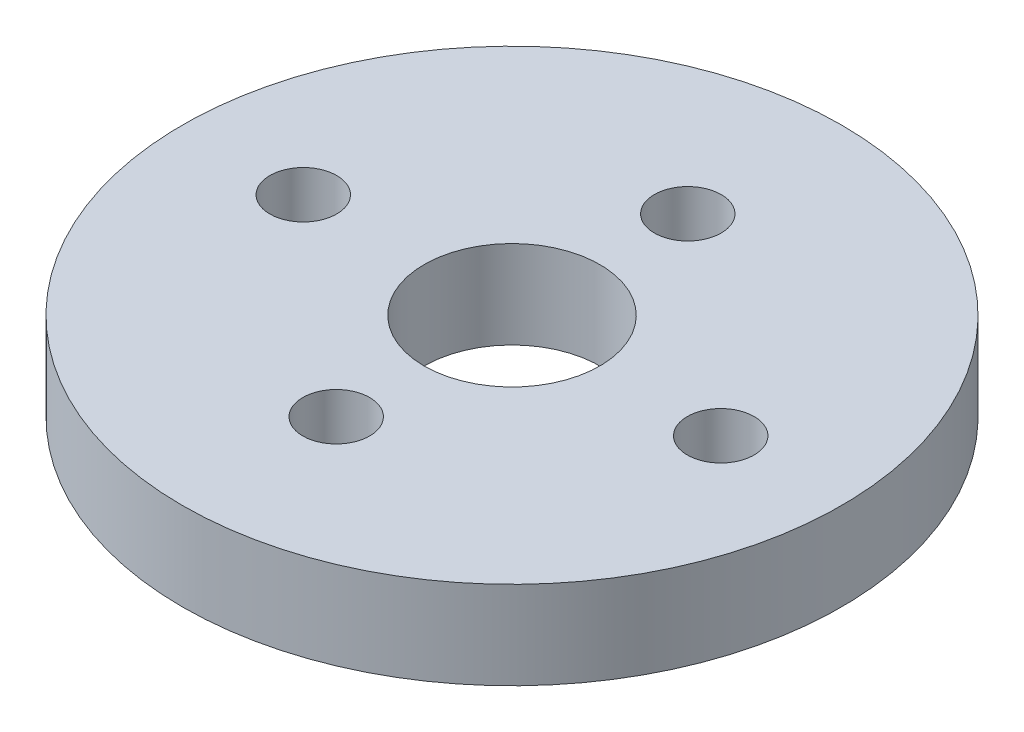
ISO-10303-21;
HEADER;
FILE_DESCRIPTION(('STEP AP214'),'2;1');
FILE_NAME('part.step','',(''),(''),'','','');
FILE_SCHEMA(('AUTOMOTIVE_DESIGN { 1 0 10303 214 1 1 1 1 }'));
ENDSEC;
DATA;
#1=APPLICATION_CONTEXT('core data for automotive mechanical design processes');
#2=APPLICATION_PROTOCOL_DEFINITION('international standard','automotive_design',2000,#1);
#3=PRODUCT_CONTEXT('',#1,'mechanical');
#4=PRODUCT('Part','Part','',(#3));
#5=PRODUCT_RELATED_PRODUCT_CATEGORY('part','',(#4));
#6=PRODUCT_DEFINITION_FORMATION('','',#4);
#7=PRODUCT_DEFINITION_CONTEXT('part definition',#1,'design');
#8=PRODUCT_DEFINITION('design','',#6,#7);
#9=PRODUCT_DEFINITION_SHAPE('','',#8);
#10=(LENGTH_UNIT() NAMED_UNIT(*) SI_UNIT(.MILLI.,.METRE.));
#11=(NAMED_UNIT(*) PLANE_ANGLE_UNIT() SI_UNIT($,.RADIAN.));
#12=(NAMED_UNIT(*) SI_UNIT($,.STERADIAN.) SOLID_ANGLE_UNIT());
#13=UNCERTAINTY_MEASURE_WITH_UNIT(LENGTH_MEASURE(1.E-05),#10,'distance_accuracy_value','');
#14=(GEOMETRIC_REPRESENTATION_CONTEXT(3) GLOBAL_UNCERTAINTY_ASSIGNED_CONTEXT((#13)) GLOBAL_UNIT_ASSIGNED_CONTEXT((#10,
#11,#12)) REPRESENTATION_CONTEXT('',''));
#15=CARTESIAN_POINT('',(0.,0.,0.));
#16=DIRECTION('',(0.,0.,1.));
#17=DIRECTION('',(1.,0.,0.));
#18=AXIS2_PLACEMENT_3D('',#15,#16,#17);
#19=CARTESIAN_POINT('',(0.,4.,0.));
#20=DIRECTION('',(0.,-1.,0.));
#21=DIRECTION('',(0.,0.,-1.));
#22=AXIS2_PLACEMENT_3D('',#19,#20,#21);
#23=CYLINDRICAL_SURFACE('',#22,15.);
#24=CARTESIAN_POINT('',(0.,4.,0.));
#25=DIRECTION('',(0.,1.,0.));
#26=DIRECTION('',(0.,0.,1.));
#27=AXIS2_PLACEMENT_3D('',#24,#25,#26);
#28=CIRCLE('',#27,15.);
#29=CARTESIAN_POINT('',(0.,4.,15.));
#30=VERTEX_POINT('',#29);
#31=EDGE_CURVE('E10',#30,#30,#28,.T.);
#32=ORIENTED_EDGE('',*,*,#31,.F.);
#33=EDGE_LOOP('',(#32));
#34=FACE_BOUND('',#33,.T.);
#35=CARTESIAN_POINT('',(0.,0.,0.));
#36=DIRECTION('',(0.,1.,0.));
#37=DIRECTION('',(0.,0.,1.));
#38=AXIS2_PLACEMENT_3D('',#35,#36,#37);
#39=CIRCLE('',#38,15.);
#40=CARTESIAN_POINT('',(0.,0.,15.));
#41=VERTEX_POINT('',#40);
#42=EDGE_CURVE('E40',#41,#41,#39,.T.);
#43=ORIENTED_EDGE('',*,*,#42,.T.);
#44=EDGE_LOOP('',(#43));
#45=FACE_BOUND('',#44,.T.);
#46=ADVANCED_FACE('F37',(#34,#45),#23,.T.);
#47=CARTESIAN_POINT('',(0.,4.,0.));
#48=DIRECTION('',(0.,1.,0.));
#49=DIRECTION('',(0.,0.,1.));
#50=AXIS2_PLACEMENT_3D('',#47,#48,#49);
#51=PLANE('',#50);
#52=CARTESIAN_POINT('',(-9.5,4.,0.));
#53=DIRECTION('',(0.,1.,0.));
#54=DIRECTION('',(0.,0.,1.));
#55=AXIS2_PLACEMENT_3D('',#52,#53,#54);
#56=CIRCLE('',#55,1.52);
#57=CARTESIAN_POINT('',(-9.5,4.,1.52));
#58=VERTEX_POINT('',#57);
#59=EDGE_CURVE('E68',#58,#58,#56,.T.);
#60=ORIENTED_EDGE('',*,*,#59,.F.);
#61=EDGE_LOOP('',(#60));
#62=FACE_BOUND('',#61,.T.);
#63=CARTESIAN_POINT('',(0.,4.,0.));
#64=DIRECTION('',(0.,1.,0.));
#65=DIRECTION('',(0.,0.,1.));
#66=AXIS2_PLACEMENT_3D('',#63,#64,#65);
#67=CIRCLE('',#66,4.);
#68=CARTESIAN_POINT('',(0.,4.,4.));
#69=VERTEX_POINT('',#68);
#70=EDGE_CURVE('E69',#69,#69,#67,.T.);
#71=ORIENTED_EDGE('',*,*,#70,.F.);
#72=EDGE_LOOP('',(#71));
#73=FACE_BOUND('',#72,.T.);
#74=CARTESIAN_POINT('',(0.,4.,-8.));
#75=DIRECTION('',(0.,1.,0.));
#76=DIRECTION('',(0.,0.,-1.));
#77=AXIS2_PLACEMENT_3D('',#74,#75,#76);
#78=CIRCLE('',#77,1.52);
#79=CARTESIAN_POINT('',(0.,4.,-9.52));
#80=VERTEX_POINT('',#79);
#81=EDGE_CURVE('E77',#80,#80,#78,.T.);
#82=ORIENTED_EDGE('',*,*,#81,.F.);
#83=EDGE_LOOP('',(#82));
#84=FACE_BOUND('',#83,.T.);
#85=CARTESIAN_POINT('',(9.5,4.,0.));
#86=DIRECTION('',(0.,1.,0.));
#87=DIRECTION('',(0.,0.,-1.));
#88=AXIS2_PLACEMENT_3D('',#85,#86,#87);
#89=CIRCLE('',#88,1.51999999999999);
#90=CARTESIAN_POINT('',(9.5,4.,-1.52));
#91=VERTEX_POINT('',#90);
#92=EDGE_CURVE('E51',#91,#91,#89,.T.);
#93=ORIENTED_EDGE('',*,*,#92,.F.);
#94=EDGE_LOOP('',(#93));
#95=FACE_BOUND('',#94,.T.);
#96=CARTESIAN_POINT('',(0.,4.,8.));
#97=DIRECTION('',(0.,1.,0.));
#98=DIRECTION('',(0.,0.,1.));
#99=AXIS2_PLACEMENT_3D('',#96,#97,#98);
#100=CIRCLE('',#99,1.52);
#101=CARTESIAN_POINT('',(0.,4.,9.52));
#102=VERTEX_POINT('',#101);
#103=EDGE_CURVE('E60',#102,#102,#100,.T.);
#104=ORIENTED_EDGE('',*,*,#103,.F.);
#105=EDGE_LOOP('',(#104));
#106=FACE_BOUND('',#105,.T.);
#107=ORIENTED_EDGE('',*,*,#31,.T.);
#108=EDGE_LOOP('',(#107));
#109=FACE_BOUND('',#108,.T.);
#110=ADVANCED_FACE('F101',(#62,#73,#84,#95,#106,#109),#51,.T.);
#111=CARTESIAN_POINT('',(0.,0.,0.));
#112=DIRECTION('',(0.,1.,0.));
#113=DIRECTION('',(0.,0.,1.));
#114=AXIS2_PLACEMENT_3D('',#111,#112,#113);
#115=PLANE('',#114);
#116=CARTESIAN_POINT('',(-9.5,0.,0.));
#117=DIRECTION('',(0.,1.,0.));
#118=DIRECTION('',(0.,0.,1.));
#119=AXIS2_PLACEMENT_3D('',#116,#117,#118);
#120=CIRCLE('',#119,1.52);
#121=CARTESIAN_POINT('',(-9.5,0.,1.52));
#122=VERTEX_POINT('',#121);
#123=EDGE_CURVE('E49',#122,#122,#120,.T.);
#124=ORIENTED_EDGE('',*,*,#123,.T.);
#125=EDGE_LOOP('',(#124));
#126=FACE_BOUND('',#125,.T.);
#127=CARTESIAN_POINT('',(0.,0.,0.));
#128=DIRECTION('',(0.,1.,0.));
#129=DIRECTION('',(0.,0.,1.));
#130=AXIS2_PLACEMENT_3D('',#127,#128,#129);
#131=CIRCLE('',#130,4.);
#132=CARTESIAN_POINT('',(0.,0.,4.));
#133=VERTEX_POINT('',#132);
#134=EDGE_CURVE('E73',#133,#133,#131,.T.);
#135=ORIENTED_EDGE('',*,*,#134,.T.);
#136=EDGE_LOOP('',(#135));
#137=FACE_BOUND('',#136,.T.);
#138=CARTESIAN_POINT('',(0.,0.,-8.));
#139=DIRECTION('',(0.,1.,0.));
#140=DIRECTION('',(0.,0.,-1.));
#141=AXIS2_PLACEMENT_3D('',#138,#139,#140);
#142=CIRCLE('',#141,1.52);
#143=CARTESIAN_POINT('',(0.,0.,-9.52));
#144=VERTEX_POINT('',#143);
#145=EDGE_CURVE('E56',#144,#144,#142,.T.);
#146=ORIENTED_EDGE('',*,*,#145,.T.);
#147=EDGE_LOOP('',(#146));
#148=FACE_BOUND('',#147,.T.);
#149=CARTESIAN_POINT('',(9.5,0.,0.));
#150=DIRECTION('',(0.,1.,0.));
#151=DIRECTION('',(0.,0.,-1.));
#152=AXIS2_PLACEMENT_3D('',#149,#150,#151);
#153=CIRCLE('',#152,1.51999999999999);
#154=CARTESIAN_POINT('',(9.5,0.,-1.52));
#155=VERTEX_POINT('',#154);
#156=EDGE_CURVE('E55',#155,#155,#153,.T.);
#157=ORIENTED_EDGE('',*,*,#156,.T.);
#158=EDGE_LOOP('',(#157));
#159=FACE_BOUND('',#158,.T.);
#160=CARTESIAN_POINT('',(0.,0.,8.));
#161=DIRECTION('',(0.,1.,0.));
#162=DIRECTION('',(0.,0.,1.));
#163=AXIS2_PLACEMENT_3D('',#160,#161,#162);
#164=CIRCLE('',#163,1.52);
#165=CARTESIAN_POINT('',(0.,0.,9.52));
#166=VERTEX_POINT('',#165);
#167=EDGE_CURVE('E64',#166,#166,#164,.T.);
#168=ORIENTED_EDGE('',*,*,#167,.T.);
#169=EDGE_LOOP('',(#168));
#170=FACE_BOUND('',#169,.T.);
#171=ORIENTED_EDGE('',*,*,#42,.F.);
#172=EDGE_LOOP('',(#171));
#173=FACE_BOUND('',#172,.T.);
#174=ADVANCED_FACE('F91',(#126,#137,#148,#159,#170,#173),#115,.F.);
#175=CARTESIAN_POINT('',(0.,0.,8.));
#176=DIRECTION('',(0.,1.,0.));
#177=DIRECTION('',(0.,0.,1.));
#178=AXIS2_PLACEMENT_3D('',#175,#176,#177);
#179=CYLINDRICAL_SURFACE('',#178,1.52);
#180=ORIENTED_EDGE('',*,*,#167,.F.);
#181=EDGE_LOOP('',(#180));
#182=FACE_BOUND('',#181,.T.);
#183=ORIENTED_EDGE('',*,*,#103,.T.);
#184=EDGE_LOOP('',(#183));
#185=FACE_BOUND('',#184,.T.);
#186=ADVANCED_FACE('F113',(#182,#185),#179,.F.);
#187=CARTESIAN_POINT('',(9.5,0.,0.));
#188=DIRECTION('',(0.,1.,0.));
#189=DIRECTION('',(0.,0.,1.));
#190=AXIS2_PLACEMENT_3D('',#187,#188,#189);
#191=CYLINDRICAL_SURFACE('',#190,1.51999999999999);
#192=ORIENTED_EDGE('',*,*,#156,.F.);
#193=EDGE_LOOP('',(#192));
#194=FACE_BOUND('',#193,.T.);
#195=ORIENTED_EDGE('',*,*,#92,.T.);
#196=EDGE_LOOP('',(#195));
#197=FACE_BOUND('',#196,.T.);
#198=ADVANCED_FACE('F115',(#194,#197),#191,.F.);
#199=CARTESIAN_POINT('',(0.,0.,-8.));
#200=DIRECTION('',(0.,1.,0.));
#201=DIRECTION('',(0.,0.,1.));
#202=AXIS2_PLACEMENT_3D('',#199,#200,#201);
#203=CYLINDRICAL_SURFACE('',#202,1.52);
#204=ORIENTED_EDGE('',*,*,#145,.F.);
#205=EDGE_LOOP('',(#204));
#206=FACE_BOUND('',#205,.T.);
#207=ORIENTED_EDGE('',*,*,#81,.T.);
#208=EDGE_LOOP('',(#207));
#209=FACE_BOUND('',#208,.T.);
#210=ADVANCED_FACE('F122',(#206,#209),#203,.F.);
#211=CARTESIAN_POINT('',(0.,0.,0.));
#212=DIRECTION('',(0.,1.,0.));
#213=DIRECTION('',(0.,0.,1.));
#214=AXIS2_PLACEMENT_3D('',#211,#212,#213);
#215=CYLINDRICAL_SURFACE('',#214,4.);
#216=ORIENTED_EDGE('',*,*,#134,.F.);
#217=EDGE_LOOP('',(#216));
#218=FACE_BOUND('',#217,.T.);
#219=ORIENTED_EDGE('',*,*,#70,.T.);
#220=EDGE_LOOP('',(#219));
#221=FACE_BOUND('',#220,.T.);
#222=ADVANCED_FACE('F97',(#218,#221),#215,.F.);
#223=CARTESIAN_POINT('',(-9.5,0.,0.));
#224=DIRECTION('',(0.,1.,0.));
#225=DIRECTION('',(0.,0.,1.));
#226=AXIS2_PLACEMENT_3D('',#223,#224,#225);
#227=CYLINDRICAL_SURFACE('',#226,1.52);
#228=ORIENTED_EDGE('',*,*,#123,.F.);
#229=EDGE_LOOP('',(#228));
#230=FACE_BOUND('',#229,.T.);
#231=ORIENTED_EDGE('',*,*,#59,.T.);
#232=EDGE_LOOP('',(#231));
#233=FACE_BOUND('',#232,.T.);
#234=ADVANCED_FACE('F94',(#230,#233),#227,.F.);
#235=CLOSED_SHELL('',(#46,#110,#174,#186,#198,#210,#222,#234));
#236=MANIFOLD_SOLID_BREP('B2',#235);
#237=ADVANCED_BREP_SHAPE_REPRESENTATION('',(#18,#236),#14);
#238=SHAPE_DEFINITION_REPRESENTATION(#9,#237);
ENDSEC;
END-ISO-10303-21;
